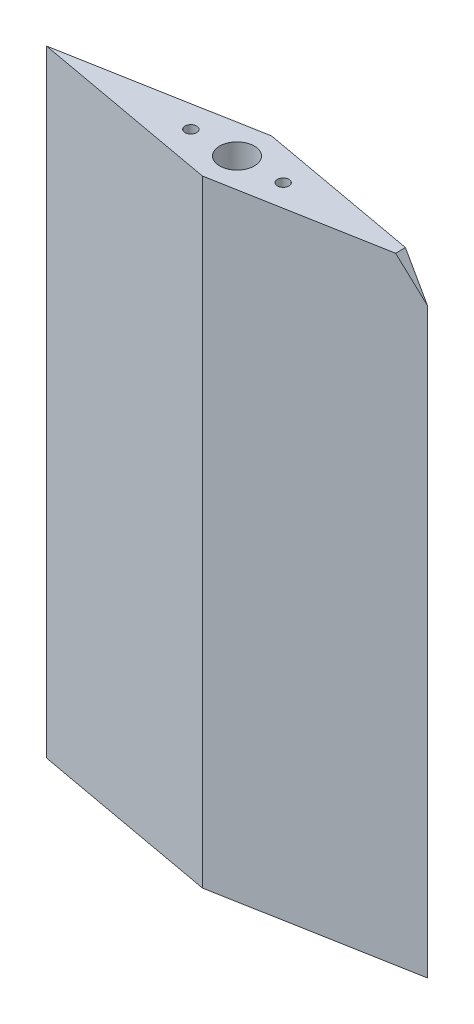
ISO-10303-21;
HEADER;
FILE_DESCRIPTION(('STEP AP214'),'2;1');
FILE_NAME('part.step','',(''),(''),'','','');
FILE_SCHEMA(('AUTOMOTIVE_DESIGN { 1 0 10303 214 1 1 1 1 }'));
ENDSEC;
DATA;
#1=APPLICATION_CONTEXT('core data for automotive mechanical design processes');
#2=APPLICATION_PROTOCOL_DEFINITION('international standard','automotive_design',2000,#1);
#3=PRODUCT_CONTEXT('',#1,'mechanical');
#4=PRODUCT('Part','Part','',(#3));
#5=PRODUCT_RELATED_PRODUCT_CATEGORY('part','',(#4));
#6=PRODUCT_DEFINITION_FORMATION('','',#4);
#7=PRODUCT_DEFINITION_CONTEXT('part definition',#1,'design');
#8=PRODUCT_DEFINITION('design','',#6,#7);
#9=PRODUCT_DEFINITION_SHAPE('','',#8);
#10=(LENGTH_UNIT() NAMED_UNIT(*) SI_UNIT(.MILLI.,.METRE.));
#11=(NAMED_UNIT(*) PLANE_ANGLE_UNIT() SI_UNIT($,.RADIAN.));
#12=(NAMED_UNIT(*) SI_UNIT($,.STERADIAN.) SOLID_ANGLE_UNIT());
#13=UNCERTAINTY_MEASURE_WITH_UNIT(LENGTH_MEASURE(1.E-05),#10,'distance_accuracy_value','');
#14=(GEOMETRIC_REPRESENTATION_CONTEXT(3) GLOBAL_UNCERTAINTY_ASSIGNED_CONTEXT((#13)) GLOBAL_UNIT_ASSIGNED_CONTEXT((#10,
#11,#12)) REPRESENTATION_CONTEXT('',''));
#15=CARTESIAN_POINT('',(0.,0.,0.));
#16=DIRECTION('',(0.,0.,1.));
#17=DIRECTION('',(1.,0.,0.));
#18=AXIS2_PLACEMENT_3D('',#15,#16,#17);
#19=CARTESIAN_POINT('',(49.4049114425268,735.656458749055,0.));
#20=DIRECTION('',(0.178885438199983,0.,0.983869910099907));
#21=DIRECTION('',(0.983869910099907,0.,-0.178885438199983));
#22=AXIS2_PLACEMENT_3D('',#19,#20,#21);
#23=PLANE('',#22);
#24=DIRECTION('',(0.,-1.,0.));
#25=VECTOR('',#24,1.);
#26=CARTESIAN_POINT('',(49.4049114425268,735.656458749055,0.));
#27=LINE('',#26,#25);
#28=CARTESIAN_POINT('',(49.4049114425268,566.076912382089,0.));
#29=VERTEX_POINT('',#28);
#30=CARTESIAN_POINT('',(49.4049114425268,396.497366015123,0.));
#31=VERTEX_POINT('',#30);
#32=EDGE_CURVE('E98',#29,#31,#27,.T.);
#33=ORIENTED_EDGE('',*,*,#32,.F.);
#34=DIRECTION('',(0.983869910099908,0.,-0.178885438199983));
#35=VECTOR('',#34,1.);
#36=CARTESIAN_POINT('',(49.4049114425268,566.076912382089,0.));
#37=LINE('',#36,#35);
#38=CARTESIAN_POINT('',(101.792411442527,566.076912382089,-9.525));
#39=VERTEX_POINT('',#38);
#40=EDGE_CURVE('E83',#29,#39,#37,.T.);
#41=ORIENTED_EDGE('',*,*,#40,.T.);
#42=DIRECTION('',(0.,-1.,0.));
#43=VECTOR('',#42,1.);
#44=CARTESIAN_POINT('',(101.792411442527,735.656458749055,-9.525));
#45=LINE('',#44,#43);
#46=CARTESIAN_POINT('',(101.792411442527,396.497366015123,-9.525));
#47=VERTEX_POINT('',#46);
#48=EDGE_CURVE('E108',#39,#47,#45,.T.);
#49=ORIENTED_EDGE('',*,*,#48,.T.);
#50=DIRECTION('',(-0.983869910099908,0.,0.178885438199983));
#51=VECTOR('',#50,1.);
#52=CARTESIAN_POINT('',(49.4049114425268,396.497366015123,0.));
#53=LINE('',#52,#51);
#54=EDGE_CURVE('E110',#47,#31,#53,.T.);
#55=ORIENTED_EDGE('',*,*,#54,.T.);
#56=EDGE_LOOP('',(#33,#41,#49,#55));
#57=FACE_BOUND('',#56,.T.);
#58=ADVANCED_FACE('F33',(#57),#23,.F.);
#59=CARTESIAN_POINT('',(101.792411442527,735.656458749055,-9.525));
#60=DIRECTION('',(-0.178885438199983,0.,0.983869910099907));
#61=DIRECTION('',(0.983869910099907,0.,0.178885438199983));
#62=AXIS2_PLACEMENT_3D('',#59,#60,#61);
#63=PLANE('',#62);
#64=ORIENTED_EDGE('',*,*,#48,.F.);
#65=DIRECTION('',(0.983869910099908,0.,0.178885438199983));
#66=VECTOR('',#65,1.);
#67=CARTESIAN_POINT('',(101.792411442527,566.076912382089,-9.525));
#68=LINE('',#67,#66);
#69=CARTESIAN_POINT('',(146.757210095391,566.076912382089,-1.34958206311564));
#70=VERTEX_POINT('',#69);
#71=EDGE_CURVE('E91',#39,#70,#68,.T.);
#72=ORIENTED_EDGE('',*,*,#71,.T.);
#73=DIRECTION('',(0.614220244823665,-0.781192595146374,0.111676408149757));
#74=VECTOR('',#73,1.);
#75=CARTESIAN_POINT('',(128.348618204766,589.489777381607,-4.69659877050188));
#76=LINE('',#75,#74);
#77=CARTESIAN_POINT('',(154.179911442527,556.636391042662,0.));
#78=VERTEX_POINT('',#77);
#79=EDGE_CURVE('E106',#70,#78,#76,.T.);
#80=ORIENTED_EDGE('',*,*,#79,.T.);
#81=DIRECTION('',(0.,-1.,0.));
#82=VECTOR('',#81,1.);
#83=CARTESIAN_POINT('',(154.179911442527,735.656458749055,0.));
#84=LINE('',#83,#82);
#85=CARTESIAN_POINT('',(154.179911442527,396.497366015123,0.));
#86=VERTEX_POINT('',#85);
#87=EDGE_CURVE('E42',#78,#86,#84,.T.);
#88=ORIENTED_EDGE('',*,*,#87,.T.);
#89=DIRECTION('',(-0.983869910099907,0.,-0.178885438199983));
#90=VECTOR('',#89,1.);
#91=CARTESIAN_POINT('',(101.792411442527,396.497366015123,-9.525));
#92=LINE('',#91,#90);
#93=EDGE_CURVE('E113',#86,#47,#92,.T.);
#94=ORIENTED_EDGE('',*,*,#93,.T.);
#95=EDGE_LOOP('',(#64,#72,#80,#88,#94));
#96=FACE_BOUND('',#95,.T.);
#97=ADVANCED_FACE('F169',(#96),#63,.F.);
#98=CARTESIAN_POINT('',(101.792411442527,735.656458749055,9.525));
#99=DIRECTION('',(-0.178885438199983,0.,-0.983869910099907));
#100=DIRECTION('',(-0.983869910099907,0.,0.178885438199983));
#101=AXIS2_PLACEMENT_3D('',#98,#99,#100);
#102=PLANE('',#101);
#103=DIRECTION('',(-0.614220244823665,0.781192595146374,0.111676408149757));
#104=VECTOR('',#103,1.);
#105=CARTESIAN_POINT('',(129.655332204645,587.827840463568,4.45901440688762));
#106=LINE('',#105,#104);
#107=CARTESIAN_POINT('',(146.757210095391,566.076912382089,1.34958206311564));
#108=VERTEX_POINT('',#107);
#109=EDGE_CURVE('E11',#78,#108,#106,.T.);
#110=ORIENTED_EDGE('',*,*,#109,.T.);
#111=DIRECTION('',(-0.983869910099908,0.,0.178885438199983));
#112=VECTOR('',#111,1.);
#113=CARTESIAN_POINT('',(101.792411442527,566.076912382089,9.525));
#114=LINE('',#113,#112);
#115=CARTESIAN_POINT('',(101.792411442527,566.076912382089,9.525));
#116=VERTEX_POINT('',#115);
#117=EDGE_CURVE('E49',#108,#116,#114,.T.);
#118=ORIENTED_EDGE('',*,*,#117,.T.);
#119=DIRECTION('',(0.,-1.,0.));
#120=VECTOR('',#119,1.);
#121=CARTESIAN_POINT('',(101.792411442527,735.656458749055,9.525));
#122=LINE('',#121,#120);
#123=CARTESIAN_POINT('',(101.792411442527,396.497366015123,9.525));
#124=VERTEX_POINT('',#123);
#125=EDGE_CURVE('E56',#116,#124,#122,.T.);
#126=ORIENTED_EDGE('',*,*,#125,.T.);
#127=DIRECTION('',(0.983869910099908,0.,-0.178885438199983));
#128=VECTOR('',#127,1.);
#129=CARTESIAN_POINT('',(101.792411442527,396.497366015123,9.525));
#130=LINE('',#129,#128);
#131=EDGE_CURVE('E101',#124,#86,#130,.T.);
#132=ORIENTED_EDGE('',*,*,#131,.T.);
#133=ORIENTED_EDGE('',*,*,#87,.F.);
#134=EDGE_LOOP('',(#110,#118,#126,#132,#133));
#135=FACE_BOUND('',#134,.T.);
#136=ADVANCED_FACE('F88',(#135),#102,.F.);
#137=CARTESIAN_POINT('',(49.4049114425268,735.656458749055,0.));
#138=DIRECTION('',(0.178885438199983,0.,-0.983869910099907));
#139=DIRECTION('',(-0.983869910099907,0.,-0.178885438199983));
#140=AXIS2_PLACEMENT_3D('',#137,#138,#139);
#141=PLANE('',#140);
#142=ORIENTED_EDGE('',*,*,#125,.F.);
#143=DIRECTION('',(-0.983869910099908,0.,-0.178885438199983));
#144=VECTOR('',#143,1.);
#145=CARTESIAN_POINT('',(49.4049114425268,566.076912382089,0.));
#146=LINE('',#145,#144);
#147=EDGE_CURVE('E80',#116,#29,#146,.T.);
#148=ORIENTED_EDGE('',*,*,#147,.T.);
#149=ORIENTED_EDGE('',*,*,#32,.T.);
#150=DIRECTION('',(0.983869910099907,0.,0.178885438199983));
#151=VECTOR('',#150,1.);
#152=CARTESIAN_POINT('',(49.4049114425268,396.497366015123,0.));
#153=LINE('',#152,#151);
#154=EDGE_CURVE('E96',#31,#124,#153,.T.);
#155=ORIENTED_EDGE('',*,*,#154,.T.);
#156=EDGE_LOOP('',(#142,#148,#149,#155));
#157=FACE_BOUND('',#156,.T.);
#158=ADVANCED_FACE('F94',(#157),#141,.F.);
#159=CARTESIAN_POINT('',(128.683999880654,589.063224066312,-9.525));
#160=DIRECTION('',(0.786110007979643,0.618086608295509,0.));
#161=DIRECTION('',(-0.618086608295509,0.786110007979643,0.));
#162=AXIS2_PLACEMENT_3D('',#159,#160,#161);
#163=PLANE('',#162);
#164=DIRECTION('',(0.,0.,-1.));
#165=VECTOR('',#164,1.);
#166=CARTESIAN_POINT('',(146.757210095391,566.076912382089,-9.525));
#167=LINE('',#166,#165);
#168=EDGE_CURVE('E92',#108,#70,#167,.T.);
#169=ORIENTED_EDGE('',*,*,#168,.F.);
#170=ORIENTED_EDGE('',*,*,#109,.F.);
#171=ORIENTED_EDGE('',*,*,#79,.F.);
#172=EDGE_LOOP('',(#169,#170,#171));
#173=FACE_BOUND('',#172,.T.);
#174=ADVANCED_FACE('F159',(#173),#163,.T.);
#175=CARTESIAN_POINT('',(49.4049114425268,396.497366015123,-9.525));
#176=DIRECTION('',(0.,-1.,0.));
#177=DIRECTION('',(0.,0.,-1.));
#178=AXIS2_PLACEMENT_3D('',#175,#176,#177);
#179=PLANE('',#178);
#180=CARTESIAN_POINT('',(114.492411442527,396.497366015123,0.));
#181=DIRECTION('',(0.,-1.,0.));
#182=DIRECTION('',(0.,0.,-1.));
#183=AXIS2_PLACEMENT_3D('',#180,#181,#182);
#184=CIRCLE('',#183,1.5875);
#185=CARTESIAN_POINT('',(114.492411442527,396.497366015123,-1.5875));
#186=VERTEX_POINT('',#185);
#187=EDGE_CURVE('E141',#186,#186,#184,.T.);
#188=ORIENTED_EDGE('',*,*,#187,.F.);
#189=EDGE_LOOP('',(#188));
#190=FACE_BOUND('',#189,.T.);
#191=CARTESIAN_POINT('',(89.0924114425268,396.497366015123,0.));
#192=DIRECTION('',(0.,-1.,0.));
#193=DIRECTION('',(0.,0.,-1.));
#194=AXIS2_PLACEMENT_3D('',#191,#192,#193);
#195=CIRCLE('',#194,1.5875);
#196=CARTESIAN_POINT('',(89.0924114425268,396.497366015123,-1.5875));
#197=VERTEX_POINT('',#196);
#198=EDGE_CURVE('E135',#197,#197,#195,.T.);
#199=ORIENTED_EDGE('',*,*,#198,.F.);
#200=EDGE_LOOP('',(#199));
#201=FACE_BOUND('',#200,.T.);
#202=CARTESIAN_POINT('',(101.792411442527,396.497366015123,0.));
#203=DIRECTION('',(0.,-1.,0.));
#204=DIRECTION('',(0.,0.,-1.));
#205=AXIS2_PLACEMENT_3D('',#202,#203,#204);
#206=CIRCLE('',#205,4.7625);
#207=CARTESIAN_POINT('',(101.792411442527,396.497366015123,-4.7625));
#208=VERTEX_POINT('',#207);
#209=EDGE_CURVE('E86',#208,#208,#206,.T.);
#210=ORIENTED_EDGE('',*,*,#209,.F.);
#211=EDGE_LOOP('',(#210));
#212=FACE_BOUND('',#211,.T.);
#213=ORIENTED_EDGE('',*,*,#54,.F.);
#214=ORIENTED_EDGE('',*,*,#93,.F.);
#215=ORIENTED_EDGE('',*,*,#131,.F.);
#216=ORIENTED_EDGE('',*,*,#154,.F.);
#217=EDGE_LOOP('',(#213,#214,#215,#216));
#218=FACE_BOUND('',#217,.T.);
#219=ADVANCED_FACE('F35',(#190,#201,#212,#218),#179,.T.);
#220=CARTESIAN_POINT('',(101.792411442527,650.497366015123,0.));
#221=DIRECTION('',(0.,-1.,0.));
#222=DIRECTION('',(0.,0.,-1.));
#223=AXIS2_PLACEMENT_3D('',#220,#221,#222);
#224=CYLINDRICAL_SURFACE('',#223,4.7625);
#225=CARTESIAN_POINT('',(101.792411442527,566.076912382089,0.));
#226=DIRECTION('',(0.,-1.,0.));
#227=DIRECTION('',(0.,0.,-1.));
#228=AXIS2_PLACEMENT_3D('',#225,#226,#227);
#229=CIRCLE('',#228,4.7625);
#230=CARTESIAN_POINT('',(101.792411442527,566.076912382089,-4.7625));
#231=VERTEX_POINT('',#230);
#232=EDGE_CURVE('E37',#231,#231,#229,.F.);
#233=ORIENTED_EDGE('',*,*,#232,.T.);
#234=EDGE_LOOP('',(#233));
#235=FACE_BOUND('',#234,.T.);
#236=ORIENTED_EDGE('',*,*,#209,.T.);
#237=EDGE_LOOP('',(#236));
#238=FACE_BOUND('',#237,.T.);
#239=ADVANCED_FACE('F158',(#235,#238),#224,.F.);
#240=CARTESIAN_POINT('',(0.,566.076912382089,-9.525));
#241=DIRECTION('',(0.,-1.,0.));
#242=DIRECTION('',(0.,0.,-1.));
#243=AXIS2_PLACEMENT_3D('',#240,#241,#242);
#244=PLANE('',#243);
#245=CARTESIAN_POINT('',(114.492411442527,566.076912382089,0.));
#246=DIRECTION('',(0.,1.,0.));
#247=DIRECTION('',(0.,0.,1.));
#248=AXIS2_PLACEMENT_3D('',#245,#246,#247);
#249=CIRCLE('',#248,1.5875);
#250=CARTESIAN_POINT('',(114.492411442527,566.076912382089,1.5875));
#251=VERTEX_POINT('',#250);
#252=EDGE_CURVE('E129',#251,#251,#249,.T.);
#253=ORIENTED_EDGE('',*,*,#252,.F.);
#254=EDGE_LOOP('',(#253));
#255=FACE_BOUND('',#254,.T.);
#256=CARTESIAN_POINT('',(89.0924114425268,566.076912382089,0.));
#257=DIRECTION('',(0.,1.,0.));
#258=DIRECTION('',(0.,0.,1.));
#259=AXIS2_PLACEMENT_3D('',#256,#257,#258);
#260=CIRCLE('',#259,1.5875);
#261=CARTESIAN_POINT('',(89.0924114425268,566.076912382089,1.5875));
#262=VERTEX_POINT('',#261);
#263=EDGE_CURVE('E122',#262,#262,#260,.T.);
#264=ORIENTED_EDGE('',*,*,#263,.F.);
#265=EDGE_LOOP('',(#264));
#266=FACE_BOUND('',#265,.T.);
#267=ORIENTED_EDGE('',*,*,#232,.F.);
#268=EDGE_LOOP('',(#267));
#269=FACE_BOUND('',#268,.T.);
#270=ORIENTED_EDGE('',*,*,#117,.F.);
#271=ORIENTED_EDGE('',*,*,#168,.T.);
#272=ORIENTED_EDGE('',*,*,#71,.F.);
#273=ORIENTED_EDGE('',*,*,#40,.F.);
#274=ORIENTED_EDGE('',*,*,#147,.F.);
#275=EDGE_LOOP('',(#270,#271,#272,#273,#274));
#276=FACE_BOUND('',#275,.T.);
#277=ADVANCED_FACE('F81',(#255,#266,#269,#276),#244,.F.);
#278=CARTESIAN_POINT('',(89.0924114425268,553.376912382089,0.));
#279=DIRECTION('',(0.,1.,0.));
#280=DIRECTION('',(0.,0.,1.));
#281=AXIS2_PLACEMENT_3D('',#278,#279,#280);
#282=CYLINDRICAL_SURFACE('',#281,1.5875);
#283=CARTESIAN_POINT('',(89.0924114425268,553.376912382089,0.));
#284=DIRECTION('',(0.,1.,0.));
#285=DIRECTION('',(0.,0.,1.));
#286=AXIS2_PLACEMENT_3D('',#283,#284,#285);
#287=CIRCLE('',#286,1.5875);
#288=CARTESIAN_POINT('',(89.0924114425268,553.376912382089,1.5875));
#289=VERTEX_POINT('',#288);
#290=EDGE_CURVE('E125',#289,#289,#287,.T.);
#291=ORIENTED_EDGE('',*,*,#290,.F.);
#292=EDGE_LOOP('',(#291));
#293=FACE_BOUND('',#292,.T.);
#294=ORIENTED_EDGE('',*,*,#263,.T.);
#295=EDGE_LOOP('',(#294));
#296=FACE_BOUND('',#295,.T.);
#297=ADVANCED_FACE('F225',(#293,#296),#282,.F.);
#298=CARTESIAN_POINT('',(89.0924114425268,553.376912382089,0.));
#299=DIRECTION('',(0.,1.,0.));
#300=DIRECTION('',(0.,0.,1.));
#301=AXIS2_PLACEMENT_3D('',#298,#299,#300);
#302=PLANE('',#301);
#303=ORIENTED_EDGE('',*,*,#290,.T.);
#304=EDGE_LOOP('',(#303));
#305=FACE_BOUND('',#304,.T.);
#306=ADVANCED_FACE('F231',(#305),#302,.T.);
#307=CARTESIAN_POINT('',(114.492411442527,553.376912382089,0.));
#308=DIRECTION('',(0.,1.,0.));
#309=DIRECTION('',(0.,0.,1.));
#310=AXIS2_PLACEMENT_3D('',#307,#308,#309);
#311=CYLINDRICAL_SURFACE('',#310,1.5875);
#312=CARTESIAN_POINT('',(114.492411442527,553.376912382089,0.));
#313=DIRECTION('',(0.,1.,0.));
#314=DIRECTION('',(0.,0.,1.));
#315=AXIS2_PLACEMENT_3D('',#312,#313,#314);
#316=CIRCLE('',#315,1.5875);
#317=CARTESIAN_POINT('',(114.492411442527,553.376912382089,1.5875));
#318=VERTEX_POINT('',#317);
#319=EDGE_CURVE('E126',#318,#318,#316,.T.);
#320=ORIENTED_EDGE('',*,*,#319,.F.);
#321=EDGE_LOOP('',(#320));
#322=FACE_BOUND('',#321,.T.);
#323=ORIENTED_EDGE('',*,*,#252,.T.);
#324=EDGE_LOOP('',(#323));
#325=FACE_BOUND('',#324,.T.);
#326=ADVANCED_FACE('F239',(#322,#325),#311,.F.);
#327=CARTESIAN_POINT('',(114.492411442527,553.376912382089,0.));
#328=DIRECTION('',(0.,1.,0.));
#329=DIRECTION('',(0.,0.,1.));
#330=AXIS2_PLACEMENT_3D('',#327,#328,#329);
#331=PLANE('',#330);
#332=ORIENTED_EDGE('',*,*,#319,.T.);
#333=EDGE_LOOP('',(#332));
#334=FACE_BOUND('',#333,.T.);
#335=ADVANCED_FACE('F247',(#334),#331,.T.);
#336=CARTESIAN_POINT('',(89.0924114425268,409.197366015123,0.));
#337=DIRECTION('',(0.,-1.,0.));
#338=DIRECTION('',(0.,0.,-1.));
#339=AXIS2_PLACEMENT_3D('',#336,#337,#338);
#340=CYLINDRICAL_SURFACE('',#339,1.5875);
#341=CARTESIAN_POINT('',(89.0924114425268,409.197366015123,0.));
#342=DIRECTION('',(0.,-1.,0.));
#343=DIRECTION('',(0.,0.,-1.));
#344=AXIS2_PLACEMENT_3D('',#341,#342,#343);
#345=CIRCLE('',#344,1.5875);
#346=CARTESIAN_POINT('',(89.0924114425268,409.197366015123,-1.5875));
#347=VERTEX_POINT('',#346);
#348=EDGE_CURVE('E132',#347,#347,#345,.T.);
#349=ORIENTED_EDGE('',*,*,#348,.F.);
#350=EDGE_LOOP('',(#349));
#351=FACE_BOUND('',#350,.T.);
#352=ORIENTED_EDGE('',*,*,#198,.T.);
#353=EDGE_LOOP('',(#352));
#354=FACE_BOUND('',#353,.T.);
#355=ADVANCED_FACE('F254',(#351,#354),#340,.F.);
#356=CARTESIAN_POINT('',(89.0924114425268,409.197366015123,0.));
#357=DIRECTION('',(0.,-1.,0.));
#358=DIRECTION('',(0.,0.,-1.));
#359=AXIS2_PLACEMENT_3D('',#356,#357,#358);
#360=PLANE('',#359);
#361=ORIENTED_EDGE('',*,*,#348,.T.);
#362=EDGE_LOOP('',(#361));
#363=FACE_BOUND('',#362,.T.);
#364=ADVANCED_FACE('F152',(#363),#360,.T.);
#365=CARTESIAN_POINT('',(114.492411442527,409.197366015123,0.));
#366=DIRECTION('',(0.,-1.,0.));
#367=DIRECTION('',(0.,0.,-1.));
#368=AXIS2_PLACEMENT_3D('',#365,#366,#367);
#369=CYLINDRICAL_SURFACE('',#368,1.5875);
#370=CARTESIAN_POINT('',(114.492411442527,409.197366015123,0.));
#371=DIRECTION('',(0.,-1.,0.));
#372=DIRECTION('',(0.,0.,-1.));
#373=AXIS2_PLACEMENT_3D('',#370,#371,#372);
#374=CIRCLE('',#373,1.5875);
#375=CARTESIAN_POINT('',(114.492411442527,409.197366015123,-1.5875));
#376=VERTEX_POINT('',#375);
#377=EDGE_CURVE('E138',#376,#376,#374,.T.);
#378=ORIENTED_EDGE('',*,*,#377,.F.);
#379=EDGE_LOOP('',(#378));
#380=FACE_BOUND('',#379,.T.);
#381=ORIENTED_EDGE('',*,*,#187,.T.);
#382=EDGE_LOOP('',(#381));
#383=FACE_BOUND('',#382,.T.);
#384=ADVANCED_FACE('F149',(#380,#383),#369,.F.);
#385=CARTESIAN_POINT('',(114.492411442527,409.197366015123,0.));
#386=DIRECTION('',(0.,-1.,0.));
#387=DIRECTION('',(0.,0.,-1.));
#388=AXIS2_PLACEMENT_3D('',#385,#386,#387);
#389=PLANE('',#388);
#390=ORIENTED_EDGE('',*,*,#377,.T.);
#391=EDGE_LOOP('',(#390));
#392=FACE_BOUND('',#391,.T.);
#393=ADVANCED_FACE('F147',(#392),#389,.T.);
#394=CLOSED_SHELL('',(#58,#97,#136,#158,#174,#219,#239,#277,#297,#306,#326,#335,#355,#364,#384,#393));
#395=MANIFOLD_SOLID_BREP('B2',#394);
#396=ADVANCED_BREP_SHAPE_REPRESENTATION('',(#18,#395),#14);
#397=SHAPE_DEFINITION_REPRESENTATION(#9,#396);
ENDSEC;
END-ISO-10303-21;
